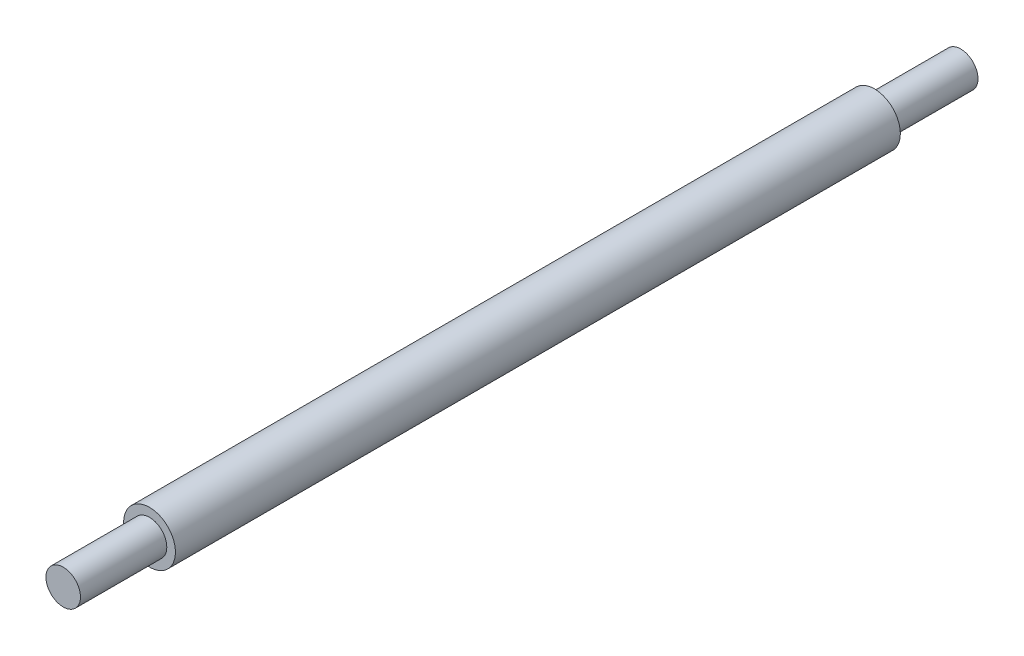
ISO-10303-21;
HEADER;
FILE_DESCRIPTION(('STEP AP214'),'2;1');
FILE_NAME('part.step','',(''),(''),'','','');
FILE_SCHEMA(('AUTOMOTIVE_DESIGN { 1 0 10303 214 1 1 1 1 }'));
ENDSEC;
DATA;
#1=APPLICATION_CONTEXT('core data for automotive mechanical design processes');
#2=APPLICATION_PROTOCOL_DEFINITION('international standard','automotive_design',2000,#1);
#3=PRODUCT_CONTEXT('',#1,'mechanical');
#4=PRODUCT('Part','Part','',(#3));
#5=PRODUCT_RELATED_PRODUCT_CATEGORY('part','',(#4));
#6=PRODUCT_DEFINITION_FORMATION('','',#4);
#7=PRODUCT_DEFINITION_CONTEXT('part definition',#1,'design');
#8=PRODUCT_DEFINITION('design','',#6,#7);
#9=PRODUCT_DEFINITION_SHAPE('','',#8);
#10=(LENGTH_UNIT() NAMED_UNIT(*) SI_UNIT(.MILLI.,.METRE.));
#11=(NAMED_UNIT(*) PLANE_ANGLE_UNIT() SI_UNIT($,.RADIAN.));
#12=(NAMED_UNIT(*) SI_UNIT($,.STERADIAN.) SOLID_ANGLE_UNIT());
#13=UNCERTAINTY_MEASURE_WITH_UNIT(LENGTH_MEASURE(1.E-05),#10,'distance_accuracy_value','');
#14=(GEOMETRIC_REPRESENTATION_CONTEXT(3) GLOBAL_UNCERTAINTY_ASSIGNED_CONTEXT((#13)) GLOBAL_UNIT_ASSIGNED_CONTEXT((#10,
#11,#12)) REPRESENTATION_CONTEXT('',''));
#15=CARTESIAN_POINT('',(0.,0.,0.));
#16=DIRECTION('',(0.,0.,1.));
#17=DIRECTION('',(1.,0.,0.));
#18=AXIS2_PLACEMENT_3D('',#15,#16,#17);
#19=CARTESIAN_POINT('',(0.,0.,0.));
#20=DIRECTION('',(0.,0.,-1.));
#21=DIRECTION('',(-1.,0.,0.));
#22=AXIS2_PLACEMENT_3D('',#19,#20,#21);
#23=PLANE('',#22);
#24=CARTESIAN_POINT('',(0.,0.,0.));
#25=DIRECTION('',(0.,0.,1.));
#26=DIRECTION('',(1.,0.,0.));
#27=AXIS2_PLACEMENT_3D('',#24,#25,#26);
#28=CIRCLE('',#27,2.);
#29=CARTESIAN_POINT('',(2.,0.,0.));
#30=VERTEX_POINT('',#29);
#31=EDGE_CURVE('E10',#30,#30,#28,.T.);
#32=ORIENTED_EDGE('',*,*,#31,.T.);
#33=EDGE_LOOP('',(#32));
#34=FACE_BOUND('',#33,.T.);
#35=ADVANCED_FACE('F37',(#34),#23,.F.);
#36=CARTESIAN_POINT('',(0.,0.,0.));
#37=DIRECTION('',(0.,0.,1.));
#38=DIRECTION('',(1.,0.,0.));
#39=AXIS2_PLACEMENT_3D('',#36,#37,#38);
#40=CYLINDRICAL_SURFACE('',#39,2.);
#41=ORIENTED_EDGE('',*,*,#31,.F.);
#42=EDGE_LOOP('',(#41));
#43=FACE_BOUND('',#42,.T.);
#44=CARTESIAN_POINT('',(0.,0.,-10.));
#45=DIRECTION('',(0.,0.,1.));
#46=DIRECTION('',(1.,0.,0.));
#47=AXIS2_PLACEMENT_3D('',#44,#45,#46);
#48=CIRCLE('',#47,2.);
#49=CARTESIAN_POINT('',(2.,0.,-10.));
#50=VERTEX_POINT('',#49);
#51=EDGE_CURVE('E44',#50,#50,#48,.T.);
#52=ORIENTED_EDGE('',*,*,#51,.T.);
#53=EDGE_LOOP('',(#52));
#54=FACE_BOUND('',#53,.T.);
#55=ADVANCED_FACE('F81',(#43,#54),#40,.T.);
#56=CARTESIAN_POINT('',(0.,2.,-10.));
#57=DIRECTION('',(0.,0.,-1.));
#58=DIRECTION('',(-1.,0.,0.));
#59=AXIS2_PLACEMENT_3D('',#56,#57,#58);
#60=PLANE('',#59);
#61=ORIENTED_EDGE('',*,*,#51,.F.);
#62=EDGE_LOOP('',(#61));
#63=FACE_BOUND('',#62,.T.);
#64=CARTESIAN_POINT('',(0.,0.,-10.));
#65=DIRECTION('',(0.,0.,1.));
#66=DIRECTION('',(1.,0.,0.));
#67=AXIS2_PLACEMENT_3D('',#64,#65,#66);
#68=CIRCLE('',#67,3.);
#69=CARTESIAN_POINT('',(3.,0.,-10.));
#70=VERTEX_POINT('',#69);
#71=EDGE_CURVE('E49',#70,#70,#68,.T.);
#72=ORIENTED_EDGE('',*,*,#71,.T.);
#73=EDGE_LOOP('',(#72));
#74=FACE_BOUND('',#73,.T.);
#75=ADVANCED_FACE('F85',(#63,#74),#60,.F.);
#76=CARTESIAN_POINT('',(0.,0.,0.));
#77=DIRECTION('',(0.,0.,1.));
#78=DIRECTION('',(1.,0.,0.));
#79=AXIS2_PLACEMENT_3D('',#76,#77,#78);
#80=CYLINDRICAL_SURFACE('',#79,3.);
#81=ORIENTED_EDGE('',*,*,#71,.F.);
#82=EDGE_LOOP('',(#81));
#83=FACE_BOUND('',#82,.T.);
#84=CARTESIAN_POINT('',(0.,0.,-94.));
#85=DIRECTION('',(0.,0.,1.));
#86=DIRECTION('',(1.,0.,0.));
#87=AXIS2_PLACEMENT_3D('',#84,#85,#86);
#88=CIRCLE('',#87,3.);
#89=CARTESIAN_POINT('',(3.,0.,-94.));
#90=VERTEX_POINT('',#89);
#91=EDGE_CURVE('E54',#90,#90,#88,.T.);
#92=ORIENTED_EDGE('',*,*,#91,.T.);
#93=EDGE_LOOP('',(#92));
#94=FACE_BOUND('',#93,.T.);
#95=ADVANCED_FACE('F90',(#83,#94),#80,.T.);
#96=CARTESIAN_POINT('',(0.,3.,-94.));
#97=DIRECTION('',(0.,0.,1.));
#98=DIRECTION('',(1.,0.,0.));
#99=AXIS2_PLACEMENT_3D('',#96,#97,#98);
#100=PLANE('',#99);
#101=ORIENTED_EDGE('',*,*,#91,.F.);
#102=EDGE_LOOP('',(#101));
#103=FACE_BOUND('',#102,.T.);
#104=CARTESIAN_POINT('',(0.,0.,-94.));
#105=DIRECTION('',(0.,0.,1.));
#106=DIRECTION('',(1.,0.,0.));
#107=AXIS2_PLACEMENT_3D('',#104,#105,#106);
#108=CIRCLE('',#107,2.);
#109=CARTESIAN_POINT('',(2.,0.,-94.));
#110=VERTEX_POINT('',#109);
#111=EDGE_CURVE('E60',#110,#110,#108,.T.);
#112=ORIENTED_EDGE('',*,*,#111,.T.);
#113=EDGE_LOOP('',(#112));
#114=FACE_BOUND('',#113,.T.);
#115=ADVANCED_FACE('F77',(#103,#114),#100,.F.);
#116=CARTESIAN_POINT('',(0.,0.,0.));
#117=DIRECTION('',(0.,0.,1.));
#118=DIRECTION('',(1.,0.,0.));
#119=AXIS2_PLACEMENT_3D('',#116,#117,#118);
#120=CYLINDRICAL_SURFACE('',#119,2.);
#121=ORIENTED_EDGE('',*,*,#111,.F.);
#122=EDGE_LOOP('',(#121));
#123=FACE_BOUND('',#122,.T.);
#124=CARTESIAN_POINT('',(0.,0.,-104.));
#125=DIRECTION('',(0.,0.,1.));
#126=DIRECTION('',(1.,0.,0.));
#127=AXIS2_PLACEMENT_3D('',#124,#125,#126);
#128=CIRCLE('',#127,2.);
#129=CARTESIAN_POINT('',(2.,0.,-104.));
#130=VERTEX_POINT('',#129);
#131=EDGE_CURVE('E64',#130,#130,#128,.T.);
#132=ORIENTED_EDGE('',*,*,#131,.T.);
#133=EDGE_LOOP('',(#132));
#134=FACE_BOUND('',#133,.T.);
#135=ADVANCED_FACE('F69',(#123,#134),#120,.T.);
#136=CARTESIAN_POINT('',(0.,2.,-104.));
#137=DIRECTION('',(0.,0.,1.));
#138=DIRECTION('',(1.,0.,0.));
#139=AXIS2_PLACEMENT_3D('',#136,#137,#138);
#140=PLANE('',#139);
#141=ORIENTED_EDGE('',*,*,#131,.F.);
#142=EDGE_LOOP('',(#141));
#143=FACE_BOUND('',#142,.T.);
#144=ADVANCED_FACE('F71',(#143),#140,.F.);
#145=CLOSED_SHELL('',(#35,#55,#75,#95,#115,#135,#144));
#146=MANIFOLD_SOLID_BREP('B2',#145);
#147=ADVANCED_BREP_SHAPE_REPRESENTATION('',(#18,#146),#14);
#148=SHAPE_DEFINITION_REPRESENTATION(#9,#147);
ENDSEC;
END-ISO-10303-21;
